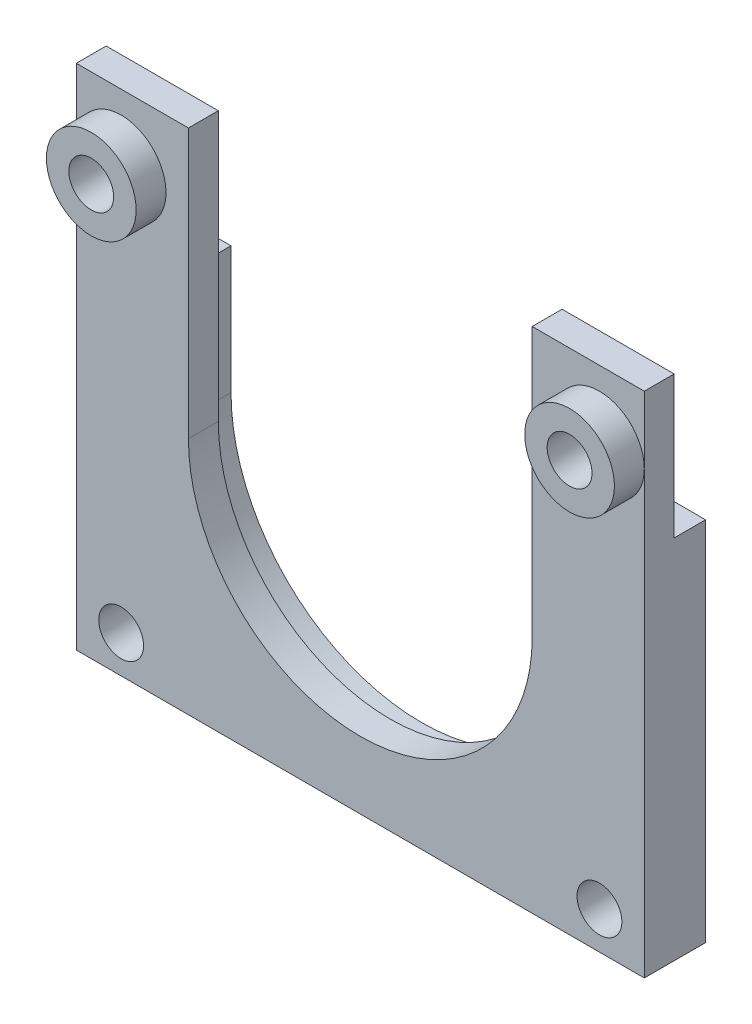
ISO-10303-21;
HEADER;
FILE_DESCRIPTION(('STEP AP214'),'2;1');
FILE_NAME('part.step','',(''),(''),'','','');
FILE_SCHEMA(('AUTOMOTIVE_DESIGN { 1 0 10303 214 1 1 1 1 }'));
ENDSEC;
DATA;
#1=APPLICATION_CONTEXT('core data for automotive mechanical design processes');
#2=APPLICATION_PROTOCOL_DEFINITION('international standard','automotive_design',2000,#1);
#3=PRODUCT_CONTEXT('',#1,'mechanical');
#4=PRODUCT('Part','Part','',(#3));
#5=PRODUCT_RELATED_PRODUCT_CATEGORY('part','',(#4));
#6=PRODUCT_DEFINITION_FORMATION('','',#4);
#7=PRODUCT_DEFINITION_CONTEXT('part definition',#1,'design');
#8=PRODUCT_DEFINITION('design','',#6,#7);
#9=PRODUCT_DEFINITION_SHAPE('','',#8);
#10=(LENGTH_UNIT() NAMED_UNIT(*) SI_UNIT(.MILLI.,.METRE.));
#11=(NAMED_UNIT(*) PLANE_ANGLE_UNIT() SI_UNIT($,.RADIAN.));
#12=(NAMED_UNIT(*) SI_UNIT($,.STERADIAN.) SOLID_ANGLE_UNIT());
#13=UNCERTAINTY_MEASURE_WITH_UNIT(LENGTH_MEASURE(1.E-05),#10,'distance_accuracy_value','');
#14=(GEOMETRIC_REPRESENTATION_CONTEXT(3) GLOBAL_UNCERTAINTY_ASSIGNED_CONTEXT((#13)) GLOBAL_UNIT_ASSIGNED_CONTEXT((#10,
#11,#12)) REPRESENTATION_CONTEXT('',''));
#15=CARTESIAN_POINT('',(0.,0.,0.));
#16=DIRECTION('',(0.,0.,1.));
#17=DIRECTION('',(1.,0.,0.));
#18=AXIS2_PLACEMENT_3D('',#15,#16,#17);
#19=CARTESIAN_POINT('',(0.,0.,4.1));
#20=DIRECTION('',(0.,0.,1.));
#21=DIRECTION('',(1.,0.,0.));
#22=AXIS2_PLACEMENT_3D('',#19,#20,#21);
#23=PLANE('',#22);
#24=CARTESIAN_POINT('',(-16.,-13.5,4.1));
#25=DIRECTION('',(0.,0.,1.));
#26=DIRECTION('',(-1.,0.,0.));
#27=AXIS2_PLACEMENT_3D('',#24,#25,#26);
#28=CIRCLE('',#27,1.5);
#29=CARTESIAN_POINT('',(-17.5,-13.5,4.1));
#30=VERTEX_POINT('',#29);
#31=EDGE_CURVE('E142',#30,#30,#28,.T.);
#32=ORIENTED_EDGE('',*,*,#31,.F.);
#33=EDGE_LOOP('',(#32));
#34=FACE_BOUND('',#33,.T.);
#35=CARTESIAN_POINT('',(16.,-13.5,4.1));
#36=DIRECTION('',(0.,0.,1.));
#37=DIRECTION('',(-1.,0.,0.));
#38=AXIS2_PLACEMENT_3D('',#35,#36,#37);
#39=CIRCLE('',#38,1.5);
#40=CARTESIAN_POINT('',(14.5,-13.5,4.1));
#41=VERTEX_POINT('',#40);
#42=EDGE_CURVE('E134',#41,#41,#39,.T.);
#43=ORIENTED_EDGE('',*,*,#42,.F.);
#44=EDGE_LOOP('',(#43));
#45=FACE_BOUND('',#44,.T.);
#46=DIRECTION('',(0.,1.,0.));
#47=VECTOR('',#46,1.);
#48=CARTESIAN_POINT('',(19.,16.,4.1));
#49=LINE('',#48,#47);
#50=CARTESIAN_POINT('',(19.,-16.,4.1));
#51=VERTEX_POINT('',#50);
#52=CARTESIAN_POINT('',(19.,13.5,4.1));
#53=VERTEX_POINT('',#52);
#54=EDGE_CURVE('E90',#51,#53,#49,.T.);
#55=ORIENTED_EDGE('',*,*,#54,.T.);
#56=CARTESIAN_POINT('',(16.,13.5,4.1));
#57=DIRECTION('',(0.,0.,1.));
#58=DIRECTION('',(1.,0.,0.));
#59=AXIS2_PLACEMENT_3D('',#56,#57,#58);
#60=CIRCLE('',#59,3.);
#61=EDGE_CURVE('E49',#53,#53,#60,.T.);
#62=ORIENTED_EDGE('',*,*,#61,.F.);
#63=CARTESIAN_POINT('',(19.,18.,4.1));
#64=VERTEX_POINT('',#63);
#65=EDGE_CURVE('E136',#53,#64,#49,.T.);
#66=ORIENTED_EDGE('',*,*,#65,.T.);
#67=DIRECTION('',(-1.,0.,0.));
#68=VECTOR('',#67,1.);
#69=CARTESIAN_POINT('',(19.,18.,4.1));
#70=LINE('',#69,#68);
#71=CARTESIAN_POINT('',(11.5,18.,4.1));
#72=VERTEX_POINT('',#71);
#73=EDGE_CURVE('E224',#64,#72,#70,.T.);
#74=ORIENTED_EDGE('',*,*,#73,.T.);
#75=DIRECTION('',(0.,-1.,0.));
#76=VECTOR('',#75,1.);
#77=CARTESIAN_POINT('',(11.5,0.,4.1));
#78=LINE('',#77,#76);
#79=CARTESIAN_POINT('',(11.5,0.,4.1));
#80=VERTEX_POINT('',#79);
#81=EDGE_CURVE('E163',#72,#80,#78,.T.);
#82=ORIENTED_EDGE('',*,*,#81,.T.);
#83=CARTESIAN_POINT('',(0.,0.,4.1));
#84=DIRECTION('',(0.,0.,-1.));
#85=DIRECTION('',(1.,0.,0.));
#86=AXIS2_PLACEMENT_3D('',#83,#84,#85);
#87=CIRCLE('',#86,11.5);
#88=CARTESIAN_POINT('',(-11.5,0.,4.1));
#89=VERTEX_POINT('',#88);
#90=EDGE_CURVE('E160',#80,#89,#87,.T.);
#91=ORIENTED_EDGE('',*,*,#90,.T.);
#92=DIRECTION('',(0.,1.,0.));
#93=VECTOR('',#92,1.);
#94=CARTESIAN_POINT('',(-11.5,16.,4.1));
#95=LINE('',#94,#93);
#96=CARTESIAN_POINT('',(-11.5,18.,4.1));
#97=VERTEX_POINT('',#96);
#98=EDGE_CURVE('E156',#89,#97,#95,.T.);
#99=ORIENTED_EDGE('',*,*,#98,.T.);
#100=DIRECTION('',(-1.,0.,0.));
#101=VECTOR('',#100,1.);
#102=CARTESIAN_POINT('',(-19.,18.,4.1));
#103=LINE('',#102,#101);
#104=CARTESIAN_POINT('',(-19.,18.,4.1));
#105=VERTEX_POINT('',#104);
#106=EDGE_CURVE('E212',#97,#105,#103,.T.);
#107=ORIENTED_EDGE('',*,*,#106,.T.);
#108=DIRECTION('',(0.,-1.,0.));
#109=VECTOR('',#108,1.);
#110=CARTESIAN_POINT('',(-19.,16.,4.1));
#111=LINE('',#110,#109);
#112=CARTESIAN_POINT('',(-19.,13.5,4.1));
#113=VERTEX_POINT('',#112);
#114=EDGE_CURVE('E109',#105,#113,#111,.T.);
#115=ORIENTED_EDGE('',*,*,#114,.T.);
#116=CARTESIAN_POINT('',(-16.,13.5,4.1));
#117=DIRECTION('',(0.,0.,1.));
#118=DIRECTION('',(1.,0.,0.));
#119=AXIS2_PLACEMENT_3D('',#116,#117,#118);
#120=CIRCLE('',#119,3.);
#121=EDGE_CURVE('E232',#113,#113,#120,.T.);
#122=ORIENTED_EDGE('',*,*,#121,.F.);
#123=CARTESIAN_POINT('',(-19.,-16.,4.1));
#124=VERTEX_POINT('',#123);
#125=EDGE_CURVE('E107',#113,#124,#111,.T.);
#126=ORIENTED_EDGE('',*,*,#125,.T.);
#127=DIRECTION('',(1.,0.,0.));
#128=VECTOR('',#127,1.);
#129=CARTESIAN_POINT('',(19.,-16.,4.1));
#130=LINE('',#129,#128);
#131=EDGE_CURVE('E57',#124,#51,#130,.T.);
#132=ORIENTED_EDGE('',*,*,#131,.T.);
#133=EDGE_LOOP('',(#55,#62,#66,#74,#82,#91,#99,#107,#115,#122,#126,#132));
#134=FACE_BOUND('',#133,.T.);
#135=ADVANCED_FACE('F36',(#34,#45,#134),#23,.T.);
#136=CARTESIAN_POINT('',(12.75,0.,4.1));
#137=DIRECTION('',(1.,0.,0.));
#138=DIRECTION('',(0.,1.,0.));
#139=AXIS2_PLACEMENT_3D('',#136,#137,#138);
#140=PLANE('',#139);
#141=DIRECTION('',(0.,1.,0.));
#142=VECTOR('',#141,1.);
#143=CARTESIAN_POINT('',(12.75,16.,2.1));
#144=LINE('',#143,#142);
#145=CARTESIAN_POINT('',(12.75,0.,2.1));
#146=VERTEX_POINT('',#145);
#147=CARTESIAN_POINT('',(12.75,8.49999999999999,2.1));
#148=VERTEX_POINT('',#147);
#149=EDGE_CURVE('E177',#146,#148,#144,.T.);
#150=ORIENTED_EDGE('',*,*,#149,.T.);
#151=DIRECTION('',(0.,0.,-1.));
#152=VECTOR('',#151,1.);
#153=CARTESIAN_POINT('',(12.75,8.49999999999999,4.1));
#154=LINE('',#153,#152);
#155=CARTESIAN_POINT('',(12.75,8.49999999999999,0.));
#156=VERTEX_POINT('',#155);
#157=EDGE_CURVE('E192',#148,#156,#154,.T.);
#158=ORIENTED_EDGE('',*,*,#157,.T.);
#159=DIRECTION('',(0.,-1.,0.));
#160=VECTOR('',#159,1.);
#161=CARTESIAN_POINT('',(12.75,0.,0.));
#162=LINE('',#161,#160);
#163=CARTESIAN_POINT('',(12.75,0.,0.));
#164=VERTEX_POINT('',#163);
#165=EDGE_CURVE('E99',#156,#164,#162,.T.);
#166=ORIENTED_EDGE('',*,*,#165,.T.);
#167=DIRECTION('',(0.,0.,-1.));
#168=VECTOR('',#167,1.);
#169=CARTESIAN_POINT('',(12.75,0.,4.1));
#170=LINE('',#169,#168);
#171=EDGE_CURVE('E89',#146,#164,#170,.T.);
#172=ORIENTED_EDGE('',*,*,#171,.F.);
#173=EDGE_LOOP('',(#150,#158,#166,#172));
#174=FACE_BOUND('',#173,.T.);
#175=ADVANCED_FACE('F266',(#174),#140,.F.);
#176=CARTESIAN_POINT('',(0.,0.,4.1));
#177=DIRECTION('',(0.,0.,-1.));
#178=DIRECTION('',(-1.,0.,0.));
#179=AXIS2_PLACEMENT_3D('',#176,#177,#178);
#180=CYLINDRICAL_SURFACE('',#179,12.75);
#181=CARTESIAN_POINT('',(0.,0.,2.1));
#182=DIRECTION('',(0.,0.,1.));
#183=DIRECTION('',(1.,0.,0.));
#184=AXIS2_PLACEMENT_3D('',#181,#182,#183);
#185=CIRCLE('',#184,12.75);
#186=CARTESIAN_POINT('',(-12.75,0.,2.1));
#187=VERTEX_POINT('',#186);
#188=EDGE_CURVE('E159',#187,#146,#185,.T.);
#189=ORIENTED_EDGE('',*,*,#188,.T.);
#190=ORIENTED_EDGE('',*,*,#171,.T.);
#191=CARTESIAN_POINT('',(0.,0.,0.));
#192=DIRECTION('',(0.,0.,-1.));
#193=DIRECTION('',(1.,0.,0.));
#194=AXIS2_PLACEMENT_3D('',#191,#192,#193);
#195=CIRCLE('',#194,12.75);
#196=CARTESIAN_POINT('',(-12.75,0.,0.));
#197=VERTEX_POINT('',#196);
#198=EDGE_CURVE('E94',#164,#197,#195,.T.);
#199=ORIENTED_EDGE('',*,*,#198,.T.);
#200=DIRECTION('',(0.,0.,-1.));
#201=VECTOR('',#200,1.);
#202=CARTESIAN_POINT('',(-12.75,0.,4.1));
#203=LINE('',#202,#201);
#204=EDGE_CURVE('E77',#187,#197,#203,.T.);
#205=ORIENTED_EDGE('',*,*,#204,.F.);
#206=EDGE_LOOP('',(#189,#190,#199,#205));
#207=FACE_BOUND('',#206,.T.);
#208=ADVANCED_FACE('F95',(#207),#180,.F.);
#209=CARTESIAN_POINT('',(-12.75,0.,4.1));
#210=DIRECTION('',(-1.,0.,0.));
#211=DIRECTION('',(0.,0.,1.));
#212=AXIS2_PLACEMENT_3D('',#209,#210,#211);
#213=PLANE('',#212);
#214=DIRECTION('',(0.,1.,0.));
#215=VECTOR('',#214,1.);
#216=CARTESIAN_POINT('',(-12.75,0.,0.));
#217=LINE('',#216,#215);
#218=CARTESIAN_POINT('',(-12.75,8.49999999999999,0.));
#219=VERTEX_POINT('',#218);
#220=EDGE_CURVE('E83',#197,#219,#217,.T.);
#221=ORIENTED_EDGE('',*,*,#220,.T.);
#222=DIRECTION('',(0.,0.,1.));
#223=VECTOR('',#222,1.);
#224=CARTESIAN_POINT('',(-12.75,8.49999999999999,4.1));
#225=LINE('',#224,#223);
#226=CARTESIAN_POINT('',(-12.75,8.49999999999999,2.1));
#227=VERTEX_POINT('',#226);
#228=EDGE_CURVE('E195',#219,#227,#225,.T.);
#229=ORIENTED_EDGE('',*,*,#228,.T.);
#230=DIRECTION('',(0.,-1.,0.));
#231=VECTOR('',#230,1.);
#232=CARTESIAN_POINT('',(-12.75,0.,2.1));
#233=LINE('',#232,#231);
#234=EDGE_CURVE('E85',#227,#187,#233,.T.);
#235=ORIENTED_EDGE('',*,*,#234,.T.);
#236=ORIENTED_EDGE('',*,*,#204,.T.);
#237=EDGE_LOOP('',(#221,#229,#235,#236));
#238=FACE_BOUND('',#237,.T.);
#239=ADVANCED_FACE('F79',(#238),#213,.F.);
#240=CARTESIAN_POINT('',(0.,0.,0.));
#241=DIRECTION('',(0.,0.,1.));
#242=DIRECTION('',(1.,0.,0.));
#243=AXIS2_PLACEMENT_3D('',#240,#241,#242);
#244=PLANE('',#243);
#245=DIRECTION('',(0.,-1.,0.));
#246=VECTOR('',#245,1.);
#247=CARTESIAN_POINT('',(-19.,16.,0.));
#248=LINE('',#247,#246);
#249=CARTESIAN_POINT('',(-19.,8.49999999999999,0.));
#250=VERTEX_POINT('',#249);
#251=CARTESIAN_POINT('',(-19.,-16.,0.));
#252=VERTEX_POINT('',#251);
#253=EDGE_CURVE('E130',#250,#252,#248,.T.);
#254=ORIENTED_EDGE('',*,*,#253,.F.);
#255=DIRECTION('',(-1.,0.,0.));
#256=VECTOR('',#255,1.);
#257=CARTESIAN_POINT('',(-55.2048388819819,8.5,0.));
#258=LINE('',#257,#256);
#259=EDGE_CURVE('E106',#219,#250,#258,.T.);
#260=ORIENTED_EDGE('',*,*,#259,.F.);
#261=ORIENTED_EDGE('',*,*,#220,.F.);
#262=ORIENTED_EDGE('',*,*,#198,.F.);
#263=ORIENTED_EDGE('',*,*,#165,.F.);
#264=CARTESIAN_POINT('',(19.,8.49999999999998,0.));
#265=VERTEX_POINT('',#264);
#266=EDGE_CURVE('E128',#265,#156,#258,.T.);
#267=ORIENTED_EDGE('',*,*,#266,.F.);
#268=DIRECTION('',(0.,1.,0.));
#269=VECTOR('',#268,1.);
#270=CARTESIAN_POINT('',(19.,16.,0.));
#271=LINE('',#270,#269);
#272=CARTESIAN_POINT('',(19.,-16.,0.));
#273=VERTEX_POINT('',#272);
#274=EDGE_CURVE('E121',#273,#265,#271,.T.);
#275=ORIENTED_EDGE('',*,*,#274,.F.);
#276=DIRECTION('',(1.,0.,0.));
#277=VECTOR('',#276,1.);
#278=CARTESIAN_POINT('',(19.,-16.,0.));
#279=LINE('',#278,#277);
#280=EDGE_CURVE('E126',#252,#273,#279,.T.);
#281=ORIENTED_EDGE('',*,*,#280,.F.);
#282=EDGE_LOOP('',(#254,#260,#261,#262,#263,#267,#275,#281));
#283=FACE_BOUND('',#282,.T.);
#284=CARTESIAN_POINT('',(16.,-13.5,0.));
#285=DIRECTION('',(0.,0.,1.));
#286=DIRECTION('',(-1.,0.,0.));
#287=AXIS2_PLACEMENT_3D('',#284,#285,#286);
#288=CIRCLE('',#287,1.5);
#289=CARTESIAN_POINT('',(14.5,-13.5,0.));
#290=VERTEX_POINT('',#289);
#291=EDGE_CURVE('E139',#290,#290,#288,.T.);
#292=ORIENTED_EDGE('',*,*,#291,.T.);
#293=EDGE_LOOP('',(#292));
#294=FACE_BOUND('',#293,.T.);
#295=CARTESIAN_POINT('',(-16.,-13.5,0.));
#296=DIRECTION('',(0.,0.,1.));
#297=DIRECTION('',(-1.,0.,0.));
#298=AXIS2_PLACEMENT_3D('',#295,#296,#297);
#299=CIRCLE('',#298,1.5);
#300=CARTESIAN_POINT('',(-17.5,-13.5,0.));
#301=VERTEX_POINT('',#300);
#302=EDGE_CURVE('E145',#301,#301,#299,.T.);
#303=ORIENTED_EDGE('',*,*,#302,.T.);
#304=EDGE_LOOP('',(#303));
#305=FACE_BOUND('',#304,.T.);
#306=ADVANCED_FACE('F103',(#283,#294,#305),#244,.F.);
#307=CARTESIAN_POINT('',(-19.,16.,4.1));
#308=DIRECTION('',(1.,0.,0.));
#309=DIRECTION('',(0.,0.,-1.));
#310=AXIS2_PLACEMENT_3D('',#307,#308,#309);
#311=PLANE('',#310);
#312=ORIENTED_EDGE('',*,*,#114,.F.);
#313=DIRECTION('',(0.,0.,1.));
#314=VECTOR('',#313,1.);
#315=CARTESIAN_POINT('',(-19.,18.,-5.66208734813001));
#316=LINE('',#315,#314);
#317=CARTESIAN_POINT('',(-19.,18.,2.1));
#318=VERTEX_POINT('',#317);
#319=EDGE_CURVE('E211',#318,#105,#316,.T.);
#320=ORIENTED_EDGE('',*,*,#319,.F.);
#321=DIRECTION('',(0.,-1.,0.));
#322=VECTOR('',#321,1.);
#323=CARTESIAN_POINT('',(-19.,16.,2.1));
#324=LINE('',#323,#322);
#325=CARTESIAN_POINT('',(-19.,8.49999999999999,2.1));
#326=VERTEX_POINT('',#325);
#327=EDGE_CURVE('E166',#318,#326,#324,.T.);
#328=ORIENTED_EDGE('',*,*,#327,.T.);
#329=DIRECTION('',(0.,0.,-1.));
#330=VECTOR('',#329,1.);
#331=CARTESIAN_POINT('',(-19.,8.49999999999999,4.1));
#332=LINE('',#331,#330);
#333=EDGE_CURVE('E197',#326,#250,#332,.T.);
#334=ORIENTED_EDGE('',*,*,#333,.T.);
#335=ORIENTED_EDGE('',*,*,#253,.T.);
#336=DIRECTION('',(0.,0.,-1.));
#337=VECTOR('',#336,1.);
#338=CARTESIAN_POINT('',(-19.,-16.,4.1));
#339=LINE('',#338,#337);
#340=EDGE_CURVE('E11',#124,#252,#339,.T.);
#341=ORIENTED_EDGE('',*,*,#340,.F.);
#342=ORIENTED_EDGE('',*,*,#125,.F.);
#343=EDGE_LOOP('',(#312,#320,#328,#334,#335,#341,#342));
#344=FACE_BOUND('',#343,.T.);
#345=ADVANCED_FACE('F38',(#344),#311,.F.);
#346=CARTESIAN_POINT('',(19.,-16.,4.1));
#347=DIRECTION('',(0.,1.,0.));
#348=DIRECTION('',(0.,0.,1.));
#349=AXIS2_PLACEMENT_3D('',#346,#347,#348);
#350=PLANE('',#349);
#351=ORIENTED_EDGE('',*,*,#280,.T.);
#352=DIRECTION('',(0.,0.,-1.));
#353=VECTOR('',#352,1.);
#354=CARTESIAN_POINT('',(19.,-16.,4.1));
#355=LINE('',#354,#353);
#356=EDGE_CURVE('E44',#51,#273,#355,.T.);
#357=ORIENTED_EDGE('',*,*,#356,.F.);
#358=ORIENTED_EDGE('',*,*,#131,.F.);
#359=ORIENTED_EDGE('',*,*,#340,.T.);
#360=EDGE_LOOP('',(#351,#357,#358,#359));
#361=FACE_BOUND('',#360,.T.);
#362=ADVANCED_FACE('F287',(#361),#350,.F.);
#363=CARTESIAN_POINT('',(19.,16.,4.1));
#364=DIRECTION('',(-1.,0.,0.));
#365=DIRECTION('',(0.,0.,1.));
#366=AXIS2_PLACEMENT_3D('',#363,#364,#365);
#367=PLANE('',#366);
#368=DIRECTION('',(0.,0.,1.));
#369=VECTOR('',#368,1.);
#370=CARTESIAN_POINT('',(19.,8.49999999999998,4.1));
#371=LINE('',#370,#369);
#372=CARTESIAN_POINT('',(19.,8.49999999999998,2.1));
#373=VERTEX_POINT('',#372);
#374=EDGE_CURVE('E200',#265,#373,#371,.T.);
#375=ORIENTED_EDGE('',*,*,#374,.T.);
#376=DIRECTION('',(0.,1.,0.));
#377=VECTOR('',#376,1.);
#378=CARTESIAN_POINT('',(19.,16.,2.1));
#379=LINE('',#378,#377);
#380=CARTESIAN_POINT('',(19.,18.,2.1));
#381=VERTEX_POINT('',#380);
#382=EDGE_CURVE('E189',#373,#381,#379,.T.);
#383=ORIENTED_EDGE('',*,*,#382,.T.);
#384=DIRECTION('',(0.,0.,1.));
#385=VECTOR('',#384,1.);
#386=CARTESIAN_POINT('',(19.,18.,-5.66208734813001));
#387=LINE('',#386,#385);
#388=EDGE_CURVE('E220',#381,#64,#387,.T.);
#389=ORIENTED_EDGE('',*,*,#388,.T.);
#390=ORIENTED_EDGE('',*,*,#65,.F.);
#391=ORIENTED_EDGE('',*,*,#54,.F.);
#392=ORIENTED_EDGE('',*,*,#356,.T.);
#393=ORIENTED_EDGE('',*,*,#274,.T.);
#394=EDGE_LOOP('',(#375,#383,#389,#390,#391,#392,#393));
#395=FACE_BOUND('',#394,.T.);
#396=ADVANCED_FACE('F119',(#395),#367,.F.);
#397=CARTESIAN_POINT('',(-16.,13.5,4.1));
#398=DIRECTION('',(0.,0.,-1.));
#399=DIRECTION('',(-1.,0.,0.));
#400=AXIS2_PLACEMENT_3D('',#397,#398,#399);
#401=CYLINDRICAL_SURFACE('',#400,1.5);
#402=CARTESIAN_POINT('',(-16.,13.5,2.1));
#403=DIRECTION('',(0.,0.,1.));
#404=DIRECTION('',(1.,0.,0.));
#405=AXIS2_PLACEMENT_3D('',#402,#403,#404);
#406=CIRCLE('',#405,1.5);
#407=CARTESIAN_POINT('',(-14.5,13.5,2.1));
#408=VERTEX_POINT('',#407);
#409=EDGE_CURVE('E183',#408,#408,#406,.T.);
#410=ORIENTED_EDGE('',*,*,#409,.F.);
#411=EDGE_LOOP('',(#410));
#412=FACE_BOUND('',#411,.T.);
#413=CARTESIAN_POINT('',(-16.,13.5,6.1));
#414=DIRECTION('',(0.,0.,1.));
#415=DIRECTION('',(1.,0.,0.));
#416=AXIS2_PLACEMENT_3D('',#413,#414,#415);
#417=CIRCLE('',#416,1.5);
#418=CARTESIAN_POINT('',(-14.5,13.5,6.1));
#419=VERTEX_POINT('',#418);
#420=EDGE_CURVE('E235',#419,#419,#417,.T.);
#421=ORIENTED_EDGE('',*,*,#420,.T.);
#422=EDGE_LOOP('',(#421));
#423=FACE_BOUND('',#422,.T.);
#424=ADVANCED_FACE('F278',(#412,#423),#401,.F.);
#425=CARTESIAN_POINT('',(16.,13.5,4.1));
#426=DIRECTION('',(0.,0.,-1.));
#427=DIRECTION('',(-1.,0.,0.));
#428=AXIS2_PLACEMENT_3D('',#425,#426,#427);
#429=CYLINDRICAL_SURFACE('',#428,1.5);
#430=CARTESIAN_POINT('',(16.,13.5,2.1));
#431=DIRECTION('',(0.,0.,1.));
#432=DIRECTION('',(1.,0.,0.));
#433=AXIS2_PLACEMENT_3D('',#430,#431,#432);
#434=CIRCLE('',#433,1.5);
#435=CARTESIAN_POINT('',(17.5,13.5,2.1));
#436=VERTEX_POINT('',#435);
#437=EDGE_CURVE('E186',#436,#436,#434,.T.);
#438=ORIENTED_EDGE('',*,*,#437,.F.);
#439=EDGE_LOOP('',(#438));
#440=FACE_BOUND('',#439,.T.);
#441=CARTESIAN_POINT('',(16.,13.5,6.1));
#442=DIRECTION('',(0.,0.,1.));
#443=DIRECTION('',(1.,0.,0.));
#444=AXIS2_PLACEMENT_3D('',#441,#442,#443);
#445=CIRCLE('',#444,1.5);
#446=CARTESIAN_POINT('',(17.5,13.5,6.1));
#447=VERTEX_POINT('',#446);
#448=EDGE_CURVE('E242',#447,#447,#445,.T.);
#449=ORIENTED_EDGE('',*,*,#448,.T.);
#450=EDGE_LOOP('',(#449));
#451=FACE_BOUND('',#450,.T.);
#452=ADVANCED_FACE('F248',(#440,#451),#429,.F.);
#453=CARTESIAN_POINT('',(16.,-13.5,4.1));
#454=DIRECTION('',(0.,0.,-1.));
#455=DIRECTION('',(-1.,0.,0.));
#456=AXIS2_PLACEMENT_3D('',#453,#454,#455);
#457=CYLINDRICAL_SURFACE('',#456,1.5);
#458=ORIENTED_EDGE('',*,*,#42,.T.);
#459=EDGE_LOOP('',(#458));
#460=FACE_BOUND('',#459,.T.);
#461=ORIENTED_EDGE('',*,*,#291,.F.);
#462=EDGE_LOOP('',(#461));
#463=FACE_BOUND('',#462,.T.);
#464=ADVANCED_FACE('F405',(#460,#463),#457,.F.);
#465=CARTESIAN_POINT('',(-16.,-13.5,4.1));
#466=DIRECTION('',(0.,0.,-1.));
#467=DIRECTION('',(-1.,0.,0.));
#468=AXIS2_PLACEMENT_3D('',#465,#466,#467);
#469=CYLINDRICAL_SURFACE('',#468,1.5);
#470=ORIENTED_EDGE('',*,*,#31,.T.);
#471=EDGE_LOOP('',(#470));
#472=FACE_BOUND('',#471,.T.);
#473=ORIENTED_EDGE('',*,*,#302,.F.);
#474=EDGE_LOOP('',(#473));
#475=FACE_BOUND('',#474,.T.);
#476=ADVANCED_FACE('F398',(#472,#475),#469,.F.);
#477=CARTESIAN_POINT('',(-11.5,16.,2.1));
#478=DIRECTION('',(1.,0.,0.));
#479=DIRECTION('',(0.,1.,0.));
#480=AXIS2_PLACEMENT_3D('',#477,#478,#479);
#481=PLANE('',#480);
#482=ORIENTED_EDGE('',*,*,#98,.F.);
#483=DIRECTION('',(0.,0.,1.));
#484=VECTOR('',#483,1.);
#485=CARTESIAN_POINT('',(-11.5,0.,2.1));
#486=LINE('',#485,#484);
#487=CARTESIAN_POINT('',(-11.5,0.,2.1));
#488=VERTEX_POINT('',#487);
#489=EDGE_CURVE('E148',#488,#89,#486,.T.);
#490=ORIENTED_EDGE('',*,*,#489,.F.);
#491=DIRECTION('',(0.,1.,0.));
#492=VECTOR('',#491,1.);
#493=CARTESIAN_POINT('',(-11.5,16.,2.1));
#494=LINE('',#493,#492);
#495=CARTESIAN_POINT('',(-11.5,18.,2.1));
#496=VERTEX_POINT('',#495);
#497=EDGE_CURVE('E168',#488,#496,#494,.T.);
#498=ORIENTED_EDGE('',*,*,#497,.T.);
#499=DIRECTION('',(0.,0.,1.));
#500=VECTOR('',#499,1.);
#501=CARTESIAN_POINT('',(-11.5,18.,-5.66208734813001));
#502=LINE('',#501,#500);
#503=EDGE_CURVE('E208',#496,#97,#502,.T.);
#504=ORIENTED_EDGE('',*,*,#503,.T.);
#505=EDGE_LOOP('',(#482,#490,#498,#504));
#506=FACE_BOUND('',#505,.T.);
#507=ADVANCED_FACE('F326',(#506),#481,.T.);
#508=CARTESIAN_POINT('',(0.,0.,2.1));
#509=DIRECTION('',(0.,0.,1.));
#510=DIRECTION('',(1.,0.,0.));
#511=AXIS2_PLACEMENT_3D('',#508,#509,#510);
#512=CYLINDRICAL_SURFACE('',#511,11.5);
#513=ORIENTED_EDGE('',*,*,#90,.F.);
#514=DIRECTION('',(0.,0.,1.));
#515=VECTOR('',#514,1.);
#516=CARTESIAN_POINT('',(11.5,0.,2.1));
#517=LINE('',#516,#515);
#518=CARTESIAN_POINT('',(11.5,0.,2.1));
#519=VERTEX_POINT('',#518);
#520=EDGE_CURVE('E151',#519,#80,#517,.T.);
#521=ORIENTED_EDGE('',*,*,#520,.F.);
#522=CARTESIAN_POINT('',(0.,0.,2.1));
#523=DIRECTION('',(0.,0.,-1.));
#524=DIRECTION('',(1.,0.,0.));
#525=AXIS2_PLACEMENT_3D('',#522,#523,#524);
#526=CIRCLE('',#525,11.5);
#527=EDGE_CURVE('E171',#519,#488,#526,.T.);
#528=ORIENTED_EDGE('',*,*,#527,.T.);
#529=ORIENTED_EDGE('',*,*,#489,.T.);
#530=EDGE_LOOP('',(#513,#521,#528,#529));
#531=FACE_BOUND('',#530,.T.);
#532=ADVANCED_FACE('F321',(#531),#512,.F.);
#533=CARTESIAN_POINT('',(11.5,0.,2.1));
#534=DIRECTION('',(-1.,0.,0.));
#535=DIRECTION('',(0.,-1.,0.));
#536=AXIS2_PLACEMENT_3D('',#533,#534,#535);
#537=PLANE('',#536);
#538=ORIENTED_EDGE('',*,*,#81,.F.);
#539=DIRECTION('',(0.,0.,1.));
#540=VECTOR('',#539,1.);
#541=CARTESIAN_POINT('',(11.5,18.,-5.66208734813001));
#542=LINE('',#541,#540);
#543=CARTESIAN_POINT('',(11.5,18.,2.1));
#544=VERTEX_POINT('',#543);
#545=EDGE_CURVE('E223',#544,#72,#542,.T.);
#546=ORIENTED_EDGE('',*,*,#545,.F.);
#547=DIRECTION('',(0.,-1.,0.));
#548=VECTOR('',#547,1.);
#549=CARTESIAN_POINT('',(11.5,0.,2.1));
#550=LINE('',#549,#548);
#551=EDGE_CURVE('E174',#544,#519,#550,.T.);
#552=ORIENTED_EDGE('',*,*,#551,.T.);
#553=ORIENTED_EDGE('',*,*,#520,.T.);
#554=EDGE_LOOP('',(#538,#546,#552,#553));
#555=FACE_BOUND('',#554,.T.);
#556=ADVANCED_FACE('F336',(#555),#537,.T.);
#557=CARTESIAN_POINT('',(0.,0.,2.1));
#558=DIRECTION('',(0.,0.,1.));
#559=DIRECTION('',(1.,0.,0.));
#560=AXIS2_PLACEMENT_3D('',#557,#558,#559);
#561=PLANE('',#560);
#562=ORIENTED_EDGE('',*,*,#234,.F.);
#563=DIRECTION('',(-1.,0.,0.));
#564=VECTOR('',#563,1.);
#565=CARTESIAN_POINT('',(-55.2048388819819,8.5,2.1));
#566=LINE('',#565,#564);
#567=EDGE_CURVE('E203',#227,#326,#566,.T.);
#568=ORIENTED_EDGE('',*,*,#567,.T.);
#569=ORIENTED_EDGE('',*,*,#327,.F.);
#570=DIRECTION('',(1.,0.,0.));
#571=VECTOR('',#570,1.);
#572=CARTESIAN_POINT('',(-19.,18.,2.1));
#573=LINE('',#572,#571);
#574=EDGE_CURVE('E207',#318,#496,#573,.T.);
#575=ORIENTED_EDGE('',*,*,#574,.T.);
#576=ORIENTED_EDGE('',*,*,#497,.F.);
#577=ORIENTED_EDGE('',*,*,#527,.F.);
#578=ORIENTED_EDGE('',*,*,#551,.F.);
#579=DIRECTION('',(1.,0.,0.));
#580=VECTOR('',#579,1.);
#581=CARTESIAN_POINT('',(19.,18.,2.1));
#582=LINE('',#581,#580);
#583=EDGE_CURVE('E217',#544,#381,#582,.T.);
#584=ORIENTED_EDGE('',*,*,#583,.T.);
#585=ORIENTED_EDGE('',*,*,#382,.F.);
#586=EDGE_CURVE('E202',#373,#148,#566,.T.);
#587=ORIENTED_EDGE('',*,*,#586,.T.);
#588=ORIENTED_EDGE('',*,*,#149,.F.);
#589=ORIENTED_EDGE('',*,*,#188,.F.);
#590=EDGE_LOOP('',(#562,#568,#569,#575,#576,#577,#578,#584,#585,#587,#588,#589));
#591=FACE_BOUND('',#590,.T.);
#592=ORIENTED_EDGE('',*,*,#409,.T.);
#593=EDGE_LOOP('',(#592));
#594=FACE_BOUND('',#593,.T.);
#595=ORIENTED_EDGE('',*,*,#437,.T.);
#596=EDGE_LOOP('',(#595));
#597=FACE_BOUND('',#596,.T.);
#598=ADVANCED_FACE('F349',(#591,#594,#597),#561,.F.);
#599=CARTESIAN_POINT('',(-55.2048388819819,8.5,81.1447820355565));
#600=DIRECTION('',(0.,-1.,0.));
#601=DIRECTION('',(1.,0.,0.));
#602=AXIS2_PLACEMENT_3D('',#599,#600,#601);
#603=PLANE('',#602);
#604=ORIENTED_EDGE('',*,*,#586,.F.);
#605=ORIENTED_EDGE('',*,*,#374,.F.);
#606=ORIENTED_EDGE('',*,*,#266,.T.);
#607=ORIENTED_EDGE('',*,*,#157,.F.);
#608=EDGE_LOOP('',(#604,#605,#606,#607));
#609=FACE_BOUND('',#608,.T.);
#610=ADVANCED_FACE('F376',(#609),#603,.F.);
#611=ORIENTED_EDGE('',*,*,#259,.T.);
#612=ORIENTED_EDGE('',*,*,#333,.F.);
#613=ORIENTED_EDGE('',*,*,#567,.F.);
#614=ORIENTED_EDGE('',*,*,#228,.F.);
#615=EDGE_LOOP('',(#611,#612,#613,#614));
#616=FACE_BOUND('',#615,.T.);
#617=ADVANCED_FACE('F384',(#616),#603,.F.);
#618=CARTESIAN_POINT('',(-19.,18.,-5.66208734813001));
#619=DIRECTION('',(0.,1.,0.));
#620=DIRECTION('',(0.,0.,1.));
#621=AXIS2_PLACEMENT_3D('',#618,#619,#620);
#622=PLANE('',#621);
#623=ORIENTED_EDGE('',*,*,#574,.F.);
#624=ORIENTED_EDGE('',*,*,#319,.T.);
#625=ORIENTED_EDGE('',*,*,#106,.F.);
#626=ORIENTED_EDGE('',*,*,#503,.F.);
#627=EDGE_LOOP('',(#623,#624,#625,#626));
#628=FACE_BOUND('',#627,.T.);
#629=ADVANCED_FACE('F380',(#628),#622,.T.);
#630=CARTESIAN_POINT('',(19.,18.,-5.66208734813001));
#631=DIRECTION('',(0.,1.,0.));
#632=DIRECTION('',(0.,0.,1.));
#633=AXIS2_PLACEMENT_3D('',#630,#631,#632);
#634=PLANE('',#633);
#635=ORIENTED_EDGE('',*,*,#583,.F.);
#636=ORIENTED_EDGE('',*,*,#545,.T.);
#637=ORIENTED_EDGE('',*,*,#73,.F.);
#638=ORIENTED_EDGE('',*,*,#388,.F.);
#639=EDGE_LOOP('',(#635,#636,#637,#638));
#640=FACE_BOUND('',#639,.T.);
#641=ADVANCED_FACE('F343',(#640),#634,.T.);
#642=CARTESIAN_POINT('',(-16.,13.5,6.1));
#643=DIRECTION('',(0.,0.,1.));
#644=DIRECTION('',(1.,0.,0.));
#645=AXIS2_PLACEMENT_3D('',#642,#643,#644);
#646=PLANE('',#645);
#647=CARTESIAN_POINT('',(-16.,13.5,6.1));
#648=DIRECTION('',(0.,0.,1.));
#649=DIRECTION('',(1.,0.,0.));
#650=AXIS2_PLACEMENT_3D('',#647,#648,#649);
#651=CIRCLE('',#650,3.);
#652=CARTESIAN_POINT('',(-13.,13.5,6.1));
#653=VERTEX_POINT('',#652);
#654=EDGE_CURVE('E229',#653,#653,#651,.T.);
#655=ORIENTED_EDGE('',*,*,#654,.T.);
#656=EDGE_LOOP('',(#655));
#657=FACE_BOUND('',#656,.T.);
#658=ORIENTED_EDGE('',*,*,#420,.F.);
#659=EDGE_LOOP('',(#658));
#660=FACE_BOUND('',#659,.T.);
#661=ADVANCED_FACE('F262',(#657,#660),#646,.T.);
#662=CARTESIAN_POINT('',(-16.,13.5,6.1));
#663=DIRECTION('',(0.,0.,-1.));
#664=DIRECTION('',(-1.,0.,0.));
#665=AXIS2_PLACEMENT_3D('',#662,#663,#664);
#666=CYLINDRICAL_SURFACE('',#665,3.);
#667=ORIENTED_EDGE('',*,*,#654,.F.);
#668=EDGE_LOOP('',(#667));
#669=FACE_BOUND('',#668,.T.);
#670=ORIENTED_EDGE('',*,*,#121,.T.);
#671=EDGE_LOOP('',(#670));
#672=FACE_BOUND('',#671,.T.);
#673=ADVANCED_FACE('F253',(#669,#672),#666,.T.);
#674=CARTESIAN_POINT('',(16.,13.5,6.1));
#675=DIRECTION('',(0.,0.,1.));
#676=DIRECTION('',(1.,0.,0.));
#677=AXIS2_PLACEMENT_3D('',#674,#675,#676);
#678=PLANE('',#677);
#679=CARTESIAN_POINT('',(16.,13.5,6.1));
#680=DIRECTION('',(0.,0.,1.));
#681=DIRECTION('',(1.,0.,0.));
#682=AXIS2_PLACEMENT_3D('',#679,#680,#681);
#683=CIRCLE('',#682,3.);
#684=CARTESIAN_POINT('',(19.,13.5,6.1));
#685=VERTEX_POINT('',#684);
#686=EDGE_CURVE('E240',#685,#685,#683,.T.);
#687=ORIENTED_EDGE('',*,*,#686,.T.);
#688=EDGE_LOOP('',(#687));
#689=FACE_BOUND('',#688,.T.);
#690=ORIENTED_EDGE('',*,*,#448,.F.);
#691=EDGE_LOOP('',(#690));
#692=FACE_BOUND('',#691,.T.);
#693=ADVANCED_FACE('F250',(#689,#692),#678,.T.);
#694=CARTESIAN_POINT('',(16.,13.5,6.1));
#695=DIRECTION('',(0.,0.,-1.));
#696=DIRECTION('',(-1.,0.,0.));
#697=AXIS2_PLACEMENT_3D('',#694,#695,#696);
#698=CYLINDRICAL_SURFACE('',#697,3.);
#699=ORIENTED_EDGE('',*,*,#686,.F.);
#700=EDGE_LOOP('',(#699));
#701=FACE_BOUND('',#700,.T.);
#702=ORIENTED_EDGE('',*,*,#61,.T.);
#703=EDGE_LOOP('',(#702));
#704=FACE_BOUND('',#703,.T.);
#705=ADVANCED_FACE('F252',(#701,#704),#698,.T.);
#706=CLOSED_SHELL('',(#135,#175,#208,#239,#306,#345,#362,#396,#424,#452,#464,#476,#507,#532,
#556,#598,#610,#617,#629,#641,#661,#673,#693,#705));
#707=MANIFOLD_SOLID_BREP('B2',#706);
#708=ADVANCED_BREP_SHAPE_REPRESENTATION('',(#18,#707),#14);
#709=SHAPE_DEFINITION_REPRESENTATION(#9,#708);
ENDSEC;
END-ISO-10303-21;
